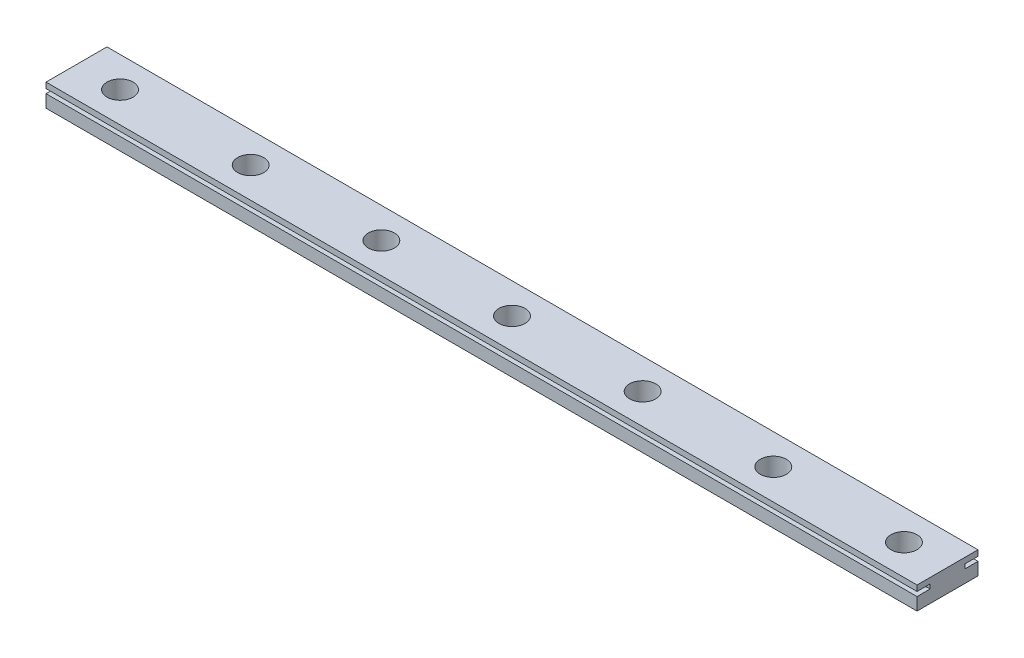
ISO-10303-21;
HEADER;
FILE_DESCRIPTION(('STEP AP214'),'2;1');
FILE_NAME('part.step','',(''),(''),'','','');
FILE_SCHEMA(('AUTOMOTIVE_DESIGN { 1 0 10303 214 1 1 1 1 }'));
ENDSEC;
DATA;
#1=APPLICATION_CONTEXT('core data for automotive mechanical design processes');
#2=APPLICATION_PROTOCOL_DEFINITION('international standard','automotive_design',2000,#1);
#3=PRODUCT_CONTEXT('',#1,'mechanical');
#4=PRODUCT('Part','Part','',(#3));
#5=PRODUCT_RELATED_PRODUCT_CATEGORY('part','',(#4));
#6=PRODUCT_DEFINITION_FORMATION('','',#4);
#7=PRODUCT_DEFINITION_CONTEXT('part definition',#1,'design');
#8=PRODUCT_DEFINITION('design','',#6,#7);
#9=PRODUCT_DEFINITION_SHAPE('','',#8);
#10=(LENGTH_UNIT() NAMED_UNIT(*) SI_UNIT(.MILLI.,.METRE.));
#11=(NAMED_UNIT(*) PLANE_ANGLE_UNIT() SI_UNIT($,.RADIAN.));
#12=(NAMED_UNIT(*) SI_UNIT($,.STERADIAN.) SOLID_ANGLE_UNIT());
#13=UNCERTAINTY_MEASURE_WITH_UNIT(LENGTH_MEASURE(1.E-05),#10,'distance_accuracy_value','');
#14=(GEOMETRIC_REPRESENTATION_CONTEXT(3) GLOBAL_UNCERTAINTY_ASSIGNED_CONTEXT((#13)) GLOBAL_UNIT_ASSIGNED_CONTEXT((#10,
#11,#12)) REPRESENTATION_CONTEXT('',''));
#15=CARTESIAN_POINT('',(0.,0.,0.));
#16=DIRECTION('',(0.,0.,1.));
#17=DIRECTION('',(1.,0.,0.));
#18=AXIS2_PLACEMENT_3D('',#15,#16,#17);
#19=CARTESIAN_POINT('',(190.,-25.8,-7.));
#20=DIRECTION('',(0.,1.,0.));
#21=DIRECTION('',(0.,0.,1.));
#22=AXIS2_PLACEMENT_3D('',#19,#20,#21);
#23=CYLINDRICAL_SURFACE('',#22,1.75);
#24=CARTESIAN_POINT('',(190.,0.,-7.));
#25=DIRECTION('',(0.,-1.,0.));
#26=DIRECTION('',(0.,0.,-1.));
#27=AXIS2_PLACEMENT_3D('',#24,#25,#26);
#28=CIRCLE('',#27,1.75);
#29=CARTESIAN_POINT('',(190.,0.,-8.75));
#30=VERTEX_POINT('',#29);
#31=EDGE_CURVE('E226',#30,#30,#28,.T.);
#32=ORIENTED_EDGE('',*,*,#31,.T.);
#33=EDGE_LOOP('',(#32));
#34=FACE_BOUND('',#33,.T.);
#35=CARTESIAN_POINT('',(190.,0.7,-7.));
#36=DIRECTION('',(0.,1.,0.));
#37=DIRECTION('',(0.,0.,1.));
#38=AXIS2_PLACEMENT_3D('',#35,#36,#37);
#39=CIRCLE('',#38,1.75);
#40=CARTESIAN_POINT('',(190.,0.7,-5.25));
#41=VERTEX_POINT('',#40);
#42=EDGE_CURVE('E658',#41,#41,#39,.T.);
#43=ORIENTED_EDGE('',*,*,#42,.T.);
#44=EDGE_LOOP('',(#43));
#45=FACE_BOUND('',#44,.T.);
#46=ADVANCED_FACE('F78',(#34,#45),#23,.F.);
#47=CARTESIAN_POINT('',(160.,-25.8,-7.));
#48=DIRECTION('',(0.,1.,0.));
#49=DIRECTION('',(0.,0.,1.));
#50=AXIS2_PLACEMENT_3D('',#47,#48,#49);
#51=CYLINDRICAL_SURFACE('',#50,1.75);
#52=CARTESIAN_POINT('',(160.,0.,-7.));
#53=DIRECTION('',(0.,-1.,0.));
#54=DIRECTION('',(0.,0.,-1.));
#55=AXIS2_PLACEMENT_3D('',#52,#53,#54);
#56=CIRCLE('',#55,1.75);
#57=CARTESIAN_POINT('',(160.,0.,-8.75));
#58=VERTEX_POINT('',#57);
#59=EDGE_CURVE('E229',#58,#58,#56,.T.);
#60=ORIENTED_EDGE('',*,*,#59,.T.);
#61=EDGE_LOOP('',(#60));
#62=FACE_BOUND('',#61,.T.);
#63=CARTESIAN_POINT('',(160.,0.7,-7.));
#64=DIRECTION('',(0.,1.,0.));
#65=DIRECTION('',(0.,0.,1.));
#66=AXIS2_PLACEMENT_3D('',#63,#64,#65);
#67=CIRCLE('',#66,1.75);
#68=CARTESIAN_POINT('',(160.,0.7,-5.25));
#69=VERTEX_POINT('',#68);
#70=EDGE_CURVE('E662',#69,#69,#67,.T.);
#71=ORIENTED_EDGE('',*,*,#70,.T.);
#72=EDGE_LOOP('',(#71));
#73=FACE_BOUND('',#72,.T.);
#74=ADVANCED_FACE('F319',(#62,#73),#51,.F.);
#75=CARTESIAN_POINT('',(130.,-25.8,-7.));
#76=DIRECTION('',(0.,1.,0.));
#77=DIRECTION('',(0.,0.,1.));
#78=AXIS2_PLACEMENT_3D('',#75,#76,#77);
#79=CYLINDRICAL_SURFACE('',#78,1.75);
#80=CARTESIAN_POINT('',(130.,0.,-7.));
#81=DIRECTION('',(0.,-1.,0.));
#82=DIRECTION('',(0.,0.,-1.));
#83=AXIS2_PLACEMENT_3D('',#80,#81,#82);
#84=CIRCLE('',#83,1.75);
#85=CARTESIAN_POINT('',(130.,0.,-8.75));
#86=VERTEX_POINT('',#85);
#87=EDGE_CURVE('E233',#86,#86,#84,.T.);
#88=ORIENTED_EDGE('',*,*,#87,.T.);
#89=EDGE_LOOP('',(#88));
#90=FACE_BOUND('',#89,.T.);
#91=CARTESIAN_POINT('',(130.,0.7,-7.));
#92=DIRECTION('',(0.,1.,0.));
#93=DIRECTION('',(0.,0.,1.));
#94=AXIS2_PLACEMENT_3D('',#91,#92,#93);
#95=CIRCLE('',#94,1.75);
#96=CARTESIAN_POINT('',(130.,0.7,-5.25));
#97=VERTEX_POINT('',#96);
#98=EDGE_CURVE('E673',#97,#97,#95,.T.);
#99=ORIENTED_EDGE('',*,*,#98,.T.);
#100=EDGE_LOOP('',(#99));
#101=FACE_BOUND('',#100,.T.);
#102=ADVANCED_FACE('F325',(#90,#101),#79,.F.);
#103=CARTESIAN_POINT('',(100.,-25.8,-7.));
#104=DIRECTION('',(0.,1.,0.));
#105=DIRECTION('',(0.,0.,1.));
#106=AXIS2_PLACEMENT_3D('',#103,#104,#105);
#107=CYLINDRICAL_SURFACE('',#106,1.75);
#108=CARTESIAN_POINT('',(100.,0.,-7.));
#109=DIRECTION('',(0.,-1.,0.));
#110=DIRECTION('',(0.,0.,-1.));
#111=AXIS2_PLACEMENT_3D('',#108,#109,#110);
#112=CIRCLE('',#111,1.75);
#113=CARTESIAN_POINT('',(100.,0.,-8.75));
#114=VERTEX_POINT('',#113);
#115=EDGE_CURVE('E236',#114,#114,#112,.T.);
#116=ORIENTED_EDGE('',*,*,#115,.T.);
#117=EDGE_LOOP('',(#116));
#118=FACE_BOUND('',#117,.T.);
#119=CARTESIAN_POINT('',(100.,0.7,-7.));
#120=DIRECTION('',(0.,1.,0.));
#121=DIRECTION('',(0.,0.,1.));
#122=AXIS2_PLACEMENT_3D('',#119,#120,#121);
#123=CIRCLE('',#122,1.75);
#124=CARTESIAN_POINT('',(100.,0.7,-5.25));
#125=VERTEX_POINT('',#124);
#126=EDGE_CURVE('E681',#125,#125,#123,.T.);
#127=ORIENTED_EDGE('',*,*,#126,.T.);
#128=EDGE_LOOP('',(#127));
#129=FACE_BOUND('',#128,.T.);
#130=ADVANCED_FACE('F492',(#118,#129),#107,.F.);
#131=CARTESIAN_POINT('',(70.,-25.8,-7.));
#132=DIRECTION('',(0.,1.,0.));
#133=DIRECTION('',(0.,0.,1.));
#134=AXIS2_PLACEMENT_3D('',#131,#132,#133);
#135=CYLINDRICAL_SURFACE('',#134,1.75);
#136=CARTESIAN_POINT('',(70.,0.,-7.));
#137=DIRECTION('',(0.,-1.,0.));
#138=DIRECTION('',(0.,0.,-1.));
#139=AXIS2_PLACEMENT_3D('',#136,#137,#138);
#140=CIRCLE('',#139,1.75);
#141=CARTESIAN_POINT('',(70.,0.,-8.75));
#142=VERTEX_POINT('',#141);
#143=EDGE_CURVE('E238',#142,#142,#140,.T.);
#144=ORIENTED_EDGE('',*,*,#143,.T.);
#145=EDGE_LOOP('',(#144));
#146=FACE_BOUND('',#145,.T.);
#147=CARTESIAN_POINT('',(70.,0.7,-7.));
#148=DIRECTION('',(0.,1.,0.));
#149=DIRECTION('',(0.,0.,1.));
#150=AXIS2_PLACEMENT_3D('',#147,#148,#149);
#151=CIRCLE('',#150,1.75);
#152=CARTESIAN_POINT('',(70.,0.7,-5.25));
#153=VERTEX_POINT('',#152);
#154=EDGE_CURVE('E690',#153,#153,#151,.T.);
#155=ORIENTED_EDGE('',*,*,#154,.T.);
#156=EDGE_LOOP('',(#155));
#157=FACE_BOUND('',#156,.T.);
#158=ADVANCED_FACE('F501',(#146,#157),#135,.F.);
#159=CARTESIAN_POINT('',(40.,-25.8,-7.));
#160=DIRECTION('',(0.,1.,0.));
#161=DIRECTION('',(0.,0.,1.));
#162=AXIS2_PLACEMENT_3D('',#159,#160,#161);
#163=CYLINDRICAL_SURFACE('',#162,1.75);
#164=CARTESIAN_POINT('',(40.,0.,-7.));
#165=DIRECTION('',(0.,-1.,0.));
#166=DIRECTION('',(0.,0.,-1.));
#167=AXIS2_PLACEMENT_3D('',#164,#165,#166);
#168=CIRCLE('',#167,1.75);
#169=CARTESIAN_POINT('',(40.,0.,-8.75));
#170=VERTEX_POINT('',#169);
#171=EDGE_CURVE('E82',#170,#170,#168,.T.);
#172=ORIENTED_EDGE('',*,*,#171,.T.);
#173=EDGE_LOOP('',(#172));
#174=FACE_BOUND('',#173,.T.);
#175=CARTESIAN_POINT('',(40.,0.7,-7.));
#176=DIRECTION('',(0.,1.,0.));
#177=DIRECTION('',(0.,0.,1.));
#178=AXIS2_PLACEMENT_3D('',#175,#176,#177);
#179=CIRCLE('',#178,1.75);
#180=CARTESIAN_POINT('',(40.,0.7,-5.25));
#181=VERTEX_POINT('',#180);
#182=EDGE_CURVE('E699',#181,#181,#179,.T.);
#183=ORIENTED_EDGE('',*,*,#182,.T.);
#184=EDGE_LOOP('',(#183));
#185=FACE_BOUND('',#184,.T.);
#186=ADVANCED_FACE('F343',(#174,#185),#163,.F.);
#187=CARTESIAN_POINT('',(10.,-25.8,-7.));
#188=DIRECTION('',(0.,1.,0.));
#189=DIRECTION('',(0.,0.,1.));
#190=AXIS2_PLACEMENT_3D('',#187,#188,#189);
#191=CYLINDRICAL_SURFACE('',#190,1.75);
#192=CARTESIAN_POINT('',(10.,0.,-7.));
#193=DIRECTION('',(0.,-1.,0.));
#194=DIRECTION('',(0.,0.,-1.));
#195=AXIS2_PLACEMENT_3D('',#192,#193,#194);
#196=CIRCLE('',#195,1.75);
#197=CARTESIAN_POINT('',(10.,0.,-8.75));
#198=VERTEX_POINT('',#197);
#199=EDGE_CURVE('E221',#198,#198,#196,.T.);
#200=ORIENTED_EDGE('',*,*,#199,.T.);
#201=EDGE_LOOP('',(#200));
#202=FACE_BOUND('',#201,.T.);
#203=CARTESIAN_POINT('',(10.,0.7,-7.));
#204=DIRECTION('',(0.,1.,0.));
#205=DIRECTION('',(0.,0.,1.));
#206=AXIS2_PLACEMENT_3D('',#203,#204,#205);
#207=CIRCLE('',#206,1.75);
#208=CARTESIAN_POINT('',(10.,0.7,-5.25));
#209=VERTEX_POINT('',#208);
#210=EDGE_CURVE('E243',#209,#209,#207,.T.);
#211=ORIENTED_EDGE('',*,*,#210,.T.);
#212=EDGE_LOOP('',(#211));
#213=FACE_BOUND('',#212,.T.);
#214=ADVANCED_FACE('F316',(#202,#213),#191,.F.);
#215=CARTESIAN_POINT('',(0.,5.2,0.));
#216=DIRECTION('',(0.,0.,-1.));
#217=DIRECTION('',(-1.,0.,0.));
#218=AXIS2_PLACEMENT_3D('',#215,#216,#217);
#219=PLANE('',#218);
#220=DIRECTION('',(0.,-1.,0.));
#221=VECTOR('',#220,1.);
#222=CARTESIAN_POINT('',(0.,5.2,0.));
#223=LINE('',#222,#221);
#224=CARTESIAN_POINT('',(0.,5.2,0.));
#225=VERTEX_POINT('',#224);
#226=CARTESIAN_POINT('',(0.,3.9,0.));
#227=VERTEX_POINT('',#226);
#228=EDGE_CURVE('E177',#225,#227,#223,.T.);
#229=ORIENTED_EDGE('',*,*,#228,.T.);
#230=DIRECTION('',(-1.,0.,0.));
#231=VECTOR('',#230,1.);
#232=CARTESIAN_POINT('',(210.,3.9,0.));
#233=LINE('',#232,#231);
#234=CARTESIAN_POINT('',(200.,3.9,0.));
#235=VERTEX_POINT('',#234);
#236=EDGE_CURVE('E275',#235,#227,#233,.T.);
#237=ORIENTED_EDGE('',*,*,#236,.F.);
#238=DIRECTION('',(0.,-1.,0.));
#239=VECTOR('',#238,1.);
#240=CARTESIAN_POINT('',(200.,5.2,0.));
#241=LINE('',#240,#239);
#242=CARTESIAN_POINT('',(200.,5.2,0.));
#243=VERTEX_POINT('',#242);
#244=EDGE_CURVE('E206',#243,#235,#241,.T.);
#245=ORIENTED_EDGE('',*,*,#244,.F.);
#246=DIRECTION('',(1.,0.,0.));
#247=VECTOR('',#246,1.);
#248=CARTESIAN_POINT('',(0.,5.2,0.));
#249=LINE('',#248,#247);
#250=EDGE_CURVE('E287',#225,#243,#249,.T.);
#251=ORIENTED_EDGE('',*,*,#250,.F.);
#252=EDGE_LOOP('',(#229,#237,#245,#251));
#253=FACE_BOUND('',#252,.T.);
#254=ADVANCED_FACE('F308',(#253),#219,.F.);
#255=CARTESIAN_POINT('',(0.,5.2,-14.));
#256=DIRECTION('',(0.,0.,1.));
#257=DIRECTION('',(1.,0.,0.));
#258=AXIS2_PLACEMENT_3D('',#255,#256,#257);
#259=PLANE('',#258);
#260=DIRECTION('',(0.,-1.,0.));
#261=VECTOR('',#260,1.);
#262=CARTESIAN_POINT('',(200.,5.2,-14.));
#263=LINE('',#262,#261);
#264=CARTESIAN_POINT('',(200.,5.2,-14.));
#265=VERTEX_POINT('',#264);
#266=CARTESIAN_POINT('',(200.,3.9,-14.));
#267=VERTEX_POINT('',#266);
#268=EDGE_CURVE('E202',#265,#267,#263,.T.);
#269=ORIENTED_EDGE('',*,*,#268,.T.);
#270=DIRECTION('',(-1.,0.,0.));
#271=VECTOR('',#270,1.);
#272=CARTESIAN_POINT('',(0.,3.9,-14.));
#273=LINE('',#272,#271);
#274=CARTESIAN_POINT('',(0.,3.9,-14.));
#275=VERTEX_POINT('',#274);
#276=EDGE_CURVE('E176',#267,#275,#273,.T.);
#277=ORIENTED_EDGE('',*,*,#276,.T.);
#278=DIRECTION('',(0.,-1.,0.));
#279=VECTOR('',#278,1.);
#280=CARTESIAN_POINT('',(0.,5.2,-14.));
#281=LINE('',#280,#279);
#282=CARTESIAN_POINT('',(0.,5.2,-14.));
#283=VERTEX_POINT('',#282);
#284=EDGE_CURVE('E193',#283,#275,#281,.T.);
#285=ORIENTED_EDGE('',*,*,#284,.F.);
#286=DIRECTION('',(-1.,0.,0.));
#287=VECTOR('',#286,1.);
#288=CARTESIAN_POINT('',(0.,5.2,-14.));
#289=LINE('',#288,#287);
#290=EDGE_CURVE('E194',#265,#283,#289,.T.);
#291=ORIENTED_EDGE('',*,*,#290,.F.);
#292=EDGE_LOOP('',(#269,#277,#285,#291));
#293=FACE_BOUND('',#292,.T.);
#294=ADVANCED_FACE('F314',(#293),#259,.F.);
#295=CARTESIAN_POINT('',(0.,5.2,0.));
#296=DIRECTION('',(1.,0.,0.));
#297=DIRECTION('',(0.,0.,-1.));
#298=AXIS2_PLACEMENT_3D('',#295,#296,#297);
#299=PLANE('',#298);
#300=ORIENTED_EDGE('',*,*,#284,.T.);
#301=DIRECTION('',(0.,0.,-1.));
#302=VECTOR('',#301,1.);
#303=CARTESIAN_POINT('',(0.,3.9,-11.));
#304=LINE('',#303,#302);
#305=CARTESIAN_POINT('',(0.,3.9,-11.));
#306=VERTEX_POINT('',#305);
#307=EDGE_CURVE('E260',#306,#275,#304,.T.);
#308=ORIENTED_EDGE('',*,*,#307,.F.);
#309=DIRECTION('',(0.,1.,0.));
#310=VECTOR('',#309,1.);
#311=CARTESIAN_POINT('',(0.,2.9,-11.));
#312=LINE('',#311,#310);
#313=CARTESIAN_POINT('',(0.,2.9,-11.));
#314=VERTEX_POINT('',#313);
#315=EDGE_CURVE('E186',#314,#306,#312,.T.);
#316=ORIENTED_EDGE('',*,*,#315,.F.);
#317=DIRECTION('',(0.,0.,1.));
#318=VECTOR('',#317,1.);
#319=CARTESIAN_POINT('',(0.,2.9,-14.));
#320=LINE('',#319,#318);
#321=CARTESIAN_POINT('',(0.,2.9,-14.));
#322=VERTEX_POINT('',#321);
#323=EDGE_CURVE('E171',#322,#314,#320,.T.);
#324=ORIENTED_EDGE('',*,*,#323,.F.);
#325=CARTESIAN_POINT('',(0.,0.,-14.));
#326=VERTEX_POINT('',#325);
#327=EDGE_CURVE('E182',#322,#326,#281,.T.);
#328=ORIENTED_EDGE('',*,*,#327,.T.);
#329=DIRECTION('',(0.,0.,1.));
#330=VECTOR('',#329,1.);
#331=CARTESIAN_POINT('',(0.,0.,0.));
#332=LINE('',#331,#330);
#333=CARTESIAN_POINT('',(0.,0.,0.));
#334=VERTEX_POINT('',#333);
#335=EDGE_CURVE('E283',#326,#334,#332,.T.);
#336=ORIENTED_EDGE('',*,*,#335,.T.);
#337=CARTESIAN_POINT('',(0.,2.9,0.));
#338=VERTEX_POINT('',#337);
#339=EDGE_CURVE('E209',#338,#334,#223,.T.);
#340=ORIENTED_EDGE('',*,*,#339,.F.);
#341=DIRECTION('',(0.,0.,1.));
#342=VECTOR('',#341,1.);
#343=CARTESIAN_POINT('',(0.,2.9,0.));
#344=LINE('',#343,#342);
#345=CARTESIAN_POINT('',(0.,2.9,-3.));
#346=VERTEX_POINT('',#345);
#347=EDGE_CURVE('E268',#346,#338,#344,.T.);
#348=ORIENTED_EDGE('',*,*,#347,.F.);
#349=DIRECTION('',(0.,-1.,0.));
#350=VECTOR('',#349,1.);
#351=CARTESIAN_POINT('',(0.,2.9,-3.));
#352=LINE('',#351,#350);
#353=CARTESIAN_POINT('',(0.,3.9,-3.));
#354=VERTEX_POINT('',#353);
#355=EDGE_CURVE('E224',#354,#346,#352,.T.);
#356=ORIENTED_EDGE('',*,*,#355,.F.);
#357=DIRECTION('',(0.,0.,-1.));
#358=VECTOR('',#357,1.);
#359=CARTESIAN_POINT('',(0.,3.9,-3.));
#360=LINE('',#359,#358);
#361=EDGE_CURVE('E270',#227,#354,#360,.T.);
#362=ORIENTED_EDGE('',*,*,#361,.F.);
#363=ORIENTED_EDGE('',*,*,#228,.F.);
#364=DIRECTION('',(0.,0.,1.));
#365=VECTOR('',#364,1.);
#366=CARTESIAN_POINT('',(0.,5.2,0.));
#367=LINE('',#366,#365);
#368=EDGE_CURVE('E284',#283,#225,#367,.T.);
#369=ORIENTED_EDGE('',*,*,#368,.F.);
#370=EDGE_LOOP('',(#300,#308,#316,#324,#328,#336,#340,#348,#356,#362,#363,#369));
#371=FACE_BOUND('',#370,.T.);
#372=ADVANCED_FACE('F80',(#371),#299,.F.);
#373=CARTESIAN_POINT('',(200.,2.9,0.));
#374=VERTEX_POINT('',#373);
#375=CARTESIAN_POINT('',(200.,0.,0.));
#376=VERTEX_POINT('',#375);
#377=EDGE_CURVE('E205',#374,#376,#241,.T.);
#378=ORIENTED_EDGE('',*,*,#377,.F.);
#379=DIRECTION('',(-1.,0.,0.));
#380=VECTOR('',#379,1.);
#381=CARTESIAN_POINT('',(210.,2.9,0.));
#382=LINE('',#381,#380);
#383=EDGE_CURVE('E95',#374,#338,#382,.T.);
#384=ORIENTED_EDGE('',*,*,#383,.T.);
#385=ORIENTED_EDGE('',*,*,#339,.T.);
#386=DIRECTION('',(1.,0.,0.));
#387=VECTOR('',#386,1.);
#388=CARTESIAN_POINT('',(0.,0.,0.));
#389=LINE('',#388,#387);
#390=EDGE_CURVE('E291',#334,#376,#389,.T.);
#391=ORIENTED_EDGE('',*,*,#390,.T.);
#392=EDGE_LOOP('',(#378,#384,#385,#391));
#393=FACE_BOUND('',#392,.T.);
#394=ADVANCED_FACE('F306',(#393),#219,.F.);
#395=CARTESIAN_POINT('',(200.,5.2,0.));
#396=DIRECTION('',(-1.,0.,0.));
#397=DIRECTION('',(0.,0.,1.));
#398=AXIS2_PLACEMENT_3D('',#395,#396,#397);
#399=PLANE('',#398);
#400=DIRECTION('',(0.,1.,0.));
#401=VECTOR('',#400,1.);
#402=CARTESIAN_POINT('',(200.,5.2,-11.));
#403=LINE('',#402,#401);
#404=CARTESIAN_POINT('',(200.,2.9,-11.));
#405=VERTEX_POINT('',#404);
#406=CARTESIAN_POINT('',(200.,3.9,-11.));
#407=VERTEX_POINT('',#406);
#408=EDGE_CURVE('E12',#405,#407,#403,.T.);
#409=ORIENTED_EDGE('',*,*,#408,.T.);
#410=DIRECTION('',(0.,0.,-1.));
#411=VECTOR('',#410,1.);
#412=CARTESIAN_POINT('',(200.,3.9,0.));
#413=LINE('',#412,#411);
#414=EDGE_CURVE('E280',#407,#267,#413,.T.);
#415=ORIENTED_EDGE('',*,*,#414,.T.);
#416=ORIENTED_EDGE('',*,*,#268,.F.);
#417=DIRECTION('',(0.,0.,-1.));
#418=VECTOR('',#417,1.);
#419=CARTESIAN_POINT('',(200.,5.2,0.));
#420=LINE('',#419,#418);
#421=EDGE_CURVE('E197',#243,#265,#420,.T.);
#422=ORIENTED_EDGE('',*,*,#421,.F.);
#423=ORIENTED_EDGE('',*,*,#244,.T.);
#424=DIRECTION('',(0.,0.,-1.));
#425=VECTOR('',#424,1.);
#426=CARTESIAN_POINT('',(200.,3.9,0.));
#427=LINE('',#426,#425);
#428=CARTESIAN_POINT('',(200.,3.9,-3.));
#429=VERTEX_POINT('',#428);
#430=EDGE_CURVE('E87',#235,#429,#427,.T.);
#431=ORIENTED_EDGE('',*,*,#430,.T.);
#432=DIRECTION('',(0.,-1.,0.));
#433=VECTOR('',#432,1.);
#434=CARTESIAN_POINT('',(200.,5.2,-3.));
#435=LINE('',#434,#433);
#436=CARTESIAN_POINT('',(200.,2.9,-3.));
#437=VERTEX_POINT('',#436);
#438=EDGE_CURVE('E216',#429,#437,#435,.T.);
#439=ORIENTED_EDGE('',*,*,#438,.T.);
#440=DIRECTION('',(0.,0.,1.));
#441=VECTOR('',#440,1.);
#442=CARTESIAN_POINT('',(200.,2.9,0.));
#443=LINE('',#442,#441);
#444=EDGE_CURVE('E214',#437,#374,#443,.T.);
#445=ORIENTED_EDGE('',*,*,#444,.T.);
#446=ORIENTED_EDGE('',*,*,#377,.T.);
#447=DIRECTION('',(0.,0.,-1.));
#448=VECTOR('',#447,1.);
#449=CARTESIAN_POINT('',(200.,0.,0.));
#450=LINE('',#449,#448);
#451=CARTESIAN_POINT('',(200.,0.,-14.));
#452=VERTEX_POINT('',#451);
#453=EDGE_CURVE('E293',#376,#452,#450,.T.);
#454=ORIENTED_EDGE('',*,*,#453,.T.);
#455=CARTESIAN_POINT('',(200.,2.9,-14.));
#456=VERTEX_POINT('',#455);
#457=EDGE_CURVE('E196',#456,#452,#263,.T.);
#458=ORIENTED_EDGE('',*,*,#457,.F.);
#459=DIRECTION('',(0.,0.,1.));
#460=VECTOR('',#459,1.);
#461=CARTESIAN_POINT('',(200.,2.9,0.));
#462=LINE('',#461,#460);
#463=EDGE_CURVE('E103',#456,#405,#462,.T.);
#464=ORIENTED_EDGE('',*,*,#463,.T.);
#465=EDGE_LOOP('',(#409,#415,#416,#422,#423,#431,#439,#445,#446,#454,#458,#464));
#466=FACE_BOUND('',#465,.T.);
#467=ADVANCED_FACE('F297',(#466),#399,.F.);
#468=ORIENTED_EDGE('',*,*,#327,.F.);
#469=DIRECTION('',(1.,0.,0.));
#470=VECTOR('',#469,1.);
#471=CARTESIAN_POINT('',(0.,2.9,-14.));
#472=LINE('',#471,#470);
#473=EDGE_CURVE('E168',#322,#456,#472,.T.);
#474=ORIENTED_EDGE('',*,*,#473,.T.);
#475=ORIENTED_EDGE('',*,*,#457,.T.);
#476=DIRECTION('',(-1.,0.,0.));
#477=VECTOR('',#476,1.);
#478=CARTESIAN_POINT('',(0.,0.,-14.));
#479=LINE('',#478,#477);
#480=EDGE_CURVE('E191',#452,#326,#479,.T.);
#481=ORIENTED_EDGE('',*,*,#480,.T.);
#482=EDGE_LOOP('',(#468,#474,#475,#481));
#483=FACE_BOUND('',#482,.T.);
#484=ADVANCED_FACE('F189',(#483),#259,.F.);
#485=CARTESIAN_POINT('',(0.,5.2,0.));
#486=DIRECTION('',(0.,-1.,0.));
#487=DIRECTION('',(0.,0.,-1.));
#488=AXIS2_PLACEMENT_3D('',#485,#486,#487);
#489=PLANE('',#488);
#490=CARTESIAN_POINT('',(40.,5.2,-7.));
#491=DIRECTION('',(0.,1.,0.));
#492=DIRECTION('',(0.,0.,1.));
#493=AXIS2_PLACEMENT_3D('',#490,#491,#492);
#494=CIRCLE('',#493,3.);
#495=CARTESIAN_POINT('',(40.,5.2,-4.));
#496=VERTEX_POINT('',#495);
#497=EDGE_CURVE('E702',#496,#496,#494,.T.);
#498=ORIENTED_EDGE('',*,*,#497,.F.);
#499=EDGE_LOOP('',(#498));
#500=FACE_BOUND('',#499,.T.);
#501=CARTESIAN_POINT('',(70.,5.2,-7.));
#502=DIRECTION('',(0.,1.,0.));
#503=DIRECTION('',(0.,0.,1.));
#504=AXIS2_PLACEMENT_3D('',#501,#502,#503);
#505=CIRCLE('',#504,3.);
#506=CARTESIAN_POINT('',(70.,5.2,-4.));
#507=VERTEX_POINT('',#506);
#508=EDGE_CURVE('E693',#507,#507,#505,.T.);
#509=ORIENTED_EDGE('',*,*,#508,.F.);
#510=EDGE_LOOP('',(#509));
#511=FACE_BOUND('',#510,.T.);
#512=CARTESIAN_POINT('',(100.,5.2,-7.));
#513=DIRECTION('',(0.,1.,0.));
#514=DIRECTION('',(0.,0.,1.));
#515=AXIS2_PLACEMENT_3D('',#512,#513,#514);
#516=CIRCLE('',#515,3.);
#517=CARTESIAN_POINT('',(100.,5.2,-4.));
#518=VERTEX_POINT('',#517);
#519=EDGE_CURVE('E684',#518,#518,#516,.T.);
#520=ORIENTED_EDGE('',*,*,#519,.F.);
#521=EDGE_LOOP('',(#520));
#522=FACE_BOUND('',#521,.T.);
#523=CARTESIAN_POINT('',(130.,5.2,-7.));
#524=DIRECTION('',(0.,1.,0.));
#525=DIRECTION('',(0.,0.,1.));
#526=AXIS2_PLACEMENT_3D('',#523,#524,#525);
#527=CIRCLE('',#526,3.);
#528=CARTESIAN_POINT('',(130.,5.2,-4.));
#529=VERTEX_POINT('',#528);
#530=EDGE_CURVE('E675',#529,#529,#527,.T.);
#531=ORIENTED_EDGE('',*,*,#530,.F.);
#532=EDGE_LOOP('',(#531));
#533=FACE_BOUND('',#532,.T.);
#534=CARTESIAN_POINT('',(160.,5.2,-7.));
#535=DIRECTION('',(0.,1.,0.));
#536=DIRECTION('',(0.,0.,1.));
#537=AXIS2_PLACEMENT_3D('',#534,#535,#536);
#538=CIRCLE('',#537,3.);
#539=CARTESIAN_POINT('',(160.,5.2,-4.));
#540=VERTEX_POINT('',#539);
#541=EDGE_CURVE('E664',#540,#540,#538,.T.);
#542=ORIENTED_EDGE('',*,*,#541,.F.);
#543=EDGE_LOOP('',(#542));
#544=FACE_BOUND('',#543,.T.);
#545=CARTESIAN_POINT('',(190.,5.2,-7.));
#546=DIRECTION('',(0.,1.,0.));
#547=DIRECTION('',(0.,0.,1.));
#548=AXIS2_PLACEMENT_3D('',#545,#546,#547);
#549=CIRCLE('',#548,3.);
#550=CARTESIAN_POINT('',(190.,5.2,-4.));
#551=VERTEX_POINT('',#550);
#552=EDGE_CURVE('E255',#551,#551,#549,.T.);
#553=ORIENTED_EDGE('',*,*,#552,.F.);
#554=EDGE_LOOP('',(#553));
#555=FACE_BOUND('',#554,.T.);
#556=CARTESIAN_POINT('',(10.,5.2,-7.));
#557=DIRECTION('',(0.,1.,0.));
#558=DIRECTION('',(0.,0.,1.));
#559=AXIS2_PLACEMENT_3D('',#556,#557,#558);
#560=CIRCLE('',#559,3.);
#561=CARTESIAN_POINT('',(10.,5.2,-4.));
#562=VERTEX_POINT('',#561);
#563=EDGE_CURVE('E247',#562,#562,#560,.T.);
#564=ORIENTED_EDGE('',*,*,#563,.F.);
#565=EDGE_LOOP('',(#564));
#566=FACE_BOUND('',#565,.T.);
#567=ORIENTED_EDGE('',*,*,#368,.T.);
#568=ORIENTED_EDGE('',*,*,#250,.T.);
#569=ORIENTED_EDGE('',*,*,#421,.T.);
#570=ORIENTED_EDGE('',*,*,#290,.T.);
#571=EDGE_LOOP('',(#567,#568,#569,#570));
#572=FACE_BOUND('',#571,.T.);
#573=ADVANCED_FACE('F365',(#500,#511,#522,#533,#544,#555,#566,#572),#489,.F.);
#574=CARTESIAN_POINT('',(0.,0.,0.));
#575=DIRECTION('',(0.,-1.,0.));
#576=DIRECTION('',(0.,0.,-1.));
#577=AXIS2_PLACEMENT_3D('',#574,#575,#576);
#578=PLANE('',#577);
#579=ORIENTED_EDGE('',*,*,#171,.F.);
#580=EDGE_LOOP('',(#579));
#581=FACE_BOUND('',#580,.T.);
#582=ORIENTED_EDGE('',*,*,#143,.F.);
#583=EDGE_LOOP('',(#582));
#584=FACE_BOUND('',#583,.T.);
#585=ORIENTED_EDGE('',*,*,#115,.F.);
#586=EDGE_LOOP('',(#585));
#587=FACE_BOUND('',#586,.T.);
#588=ORIENTED_EDGE('',*,*,#87,.F.);
#589=EDGE_LOOP('',(#588));
#590=FACE_BOUND('',#589,.T.);
#591=ORIENTED_EDGE('',*,*,#59,.F.);
#592=EDGE_LOOP('',(#591));
#593=FACE_BOUND('',#592,.T.);
#594=ORIENTED_EDGE('',*,*,#31,.F.);
#595=EDGE_LOOP('',(#594));
#596=FACE_BOUND('',#595,.T.);
#597=ORIENTED_EDGE('',*,*,#199,.F.);
#598=EDGE_LOOP('',(#597));
#599=FACE_BOUND('',#598,.T.);
#600=ORIENTED_EDGE('',*,*,#335,.F.);
#601=ORIENTED_EDGE('',*,*,#480,.F.);
#602=ORIENTED_EDGE('',*,*,#453,.F.);
#603=ORIENTED_EDGE('',*,*,#390,.F.);
#604=EDGE_LOOP('',(#600,#601,#602,#603));
#605=FACE_BOUND('',#604,.T.);
#606=ADVANCED_FACE('F301',(#581,#584,#587,#590,#593,#596,#599,#605),#578,.T.);
#607=CARTESIAN_POINT('',(210.,2.9,-11.));
#608=DIRECTION('',(0.,0.,1.));
#609=DIRECTION('',(1.,0.,0.));
#610=AXIS2_PLACEMENT_3D('',#607,#608,#609);
#611=PLANE('',#610);
#612=DIRECTION('',(-1.,0.,0.));
#613=VECTOR('',#612,1.);
#614=CARTESIAN_POINT('',(210.,2.9,-11.));
#615=LINE('',#614,#613);
#616=EDGE_CURVE('E262',#405,#314,#615,.T.);
#617=ORIENTED_EDGE('',*,*,#616,.T.);
#618=ORIENTED_EDGE('',*,*,#315,.T.);
#619=DIRECTION('',(-1.,0.,0.));
#620=VECTOR('',#619,1.);
#621=CARTESIAN_POINT('',(210.,3.9,-11.));
#622=LINE('',#621,#620);
#623=EDGE_CURVE('E263',#407,#306,#622,.T.);
#624=ORIENTED_EDGE('',*,*,#623,.F.);
#625=ORIENTED_EDGE('',*,*,#408,.F.);
#626=EDGE_LOOP('',(#617,#618,#624,#625));
#627=FACE_BOUND('',#626,.T.);
#628=ADVANCED_FACE('F348',(#627),#611,.F.);
#629=CARTESIAN_POINT('',(210.,3.9,-11.));
#630=DIRECTION('',(0.,1.,0.));
#631=DIRECTION('',(0.,0.,1.));
#632=AXIS2_PLACEMENT_3D('',#629,#630,#631);
#633=PLANE('',#632);
#634=ORIENTED_EDGE('',*,*,#623,.T.);
#635=ORIENTED_EDGE('',*,*,#307,.T.);
#636=ORIENTED_EDGE('',*,*,#276,.F.);
#637=ORIENTED_EDGE('',*,*,#414,.F.);
#638=EDGE_LOOP('',(#634,#635,#636,#637));
#639=FACE_BOUND('',#638,.T.);
#640=ADVANCED_FACE('F345',(#639),#633,.F.);
#641=CARTESIAN_POINT('',(210.,2.9,-14.));
#642=DIRECTION('',(0.,-1.,0.));
#643=DIRECTION('',(0.,0.,-1.));
#644=AXIS2_PLACEMENT_3D('',#641,#642,#643);
#645=PLANE('',#644);
#646=ORIENTED_EDGE('',*,*,#473,.F.);
#647=ORIENTED_EDGE('',*,*,#323,.T.);
#648=ORIENTED_EDGE('',*,*,#616,.F.);
#649=ORIENTED_EDGE('',*,*,#463,.F.);
#650=EDGE_LOOP('',(#646,#647,#648,#649));
#651=FACE_BOUND('',#650,.T.);
#652=ADVANCED_FACE('F170',(#651),#645,.F.);
#653=CARTESIAN_POINT('',(210.,2.9,-3.));
#654=DIRECTION('',(0.,0.,-1.));
#655=DIRECTION('',(-1.,0.,0.));
#656=AXIS2_PLACEMENT_3D('',#653,#654,#655);
#657=PLANE('',#656);
#658=DIRECTION('',(-1.,0.,0.));
#659=VECTOR('',#658,1.);
#660=CARTESIAN_POINT('',(210.,3.9,-3.));
#661=LINE('',#660,#659);
#662=EDGE_CURVE('E187',#429,#354,#661,.T.);
#663=ORIENTED_EDGE('',*,*,#662,.T.);
#664=ORIENTED_EDGE('',*,*,#355,.T.);
#665=DIRECTION('',(-1.,0.,0.));
#666=VECTOR('',#665,1.);
#667=CARTESIAN_POINT('',(210.,2.9,-3.));
#668=LINE('',#667,#666);
#669=EDGE_CURVE('E273',#437,#346,#668,.T.);
#670=ORIENTED_EDGE('',*,*,#669,.F.);
#671=ORIENTED_EDGE('',*,*,#438,.F.);
#672=EDGE_LOOP('',(#663,#664,#670,#671));
#673=FACE_BOUND('',#672,.T.);
#674=ADVANCED_FACE('F355',(#673),#657,.F.);
#675=CARTESIAN_POINT('',(210.,3.9,-3.));
#676=DIRECTION('',(0.,1.,0.));
#677=DIRECTION('',(0.,0.,1.));
#678=AXIS2_PLACEMENT_3D('',#675,#676,#677);
#679=PLANE('',#678);
#680=ORIENTED_EDGE('',*,*,#236,.T.);
#681=ORIENTED_EDGE('',*,*,#361,.T.);
#682=ORIENTED_EDGE('',*,*,#662,.F.);
#683=ORIENTED_EDGE('',*,*,#430,.F.);
#684=EDGE_LOOP('',(#680,#681,#682,#683));
#685=FACE_BOUND('',#684,.T.);
#686=ADVANCED_FACE('F356',(#685),#679,.F.);
#687=CARTESIAN_POINT('',(210.,2.9,0.));
#688=DIRECTION('',(0.,-1.,0.));
#689=DIRECTION('',(0.,0.,-1.));
#690=AXIS2_PLACEMENT_3D('',#687,#688,#689);
#691=PLANE('',#690);
#692=ORIENTED_EDGE('',*,*,#669,.T.);
#693=ORIENTED_EDGE('',*,*,#347,.T.);
#694=ORIENTED_EDGE('',*,*,#383,.F.);
#695=ORIENTED_EDGE('',*,*,#444,.F.);
#696=EDGE_LOOP('',(#692,#693,#694,#695));
#697=FACE_BOUND('',#696,.T.);
#698=ADVANCED_FACE('F339',(#697),#691,.F.);
#699=CARTESIAN_POINT('',(10.,0.7,-7.));
#700=DIRECTION('',(0.,1.,0.));
#701=DIRECTION('',(0.,0.,1.));
#702=AXIS2_PLACEMENT_3D('',#699,#700,#701);
#703=CYLINDRICAL_SURFACE('',#702,3.);
#704=CARTESIAN_POINT('',(10.,0.7,-7.));
#705=DIRECTION('',(0.,1.,0.));
#706=DIRECTION('',(0.,0.,1.));
#707=AXIS2_PLACEMENT_3D('',#704,#705,#706);
#708=CIRCLE('',#707,3.);
#709=CARTESIAN_POINT('',(10.,0.7,-4.));
#710=VERTEX_POINT('',#709);
#711=EDGE_CURVE('E225',#710,#710,#708,.T.);
#712=ORIENTED_EDGE('',*,*,#711,.F.);
#713=EDGE_LOOP('',(#712));
#714=FACE_BOUND('',#713,.T.);
#715=ORIENTED_EDGE('',*,*,#563,.T.);
#716=EDGE_LOOP('',(#715));
#717=FACE_BOUND('',#716,.T.);
#718=ADVANCED_FACE('F335',(#714,#717),#703,.F.);
#719=CARTESIAN_POINT('',(10.,0.7,-7.));
#720=DIRECTION('',(0.,1.,0.));
#721=DIRECTION('',(0.,0.,1.));
#722=AXIS2_PLACEMENT_3D('',#719,#720,#721);
#723=PLANE('',#722);
#724=ORIENTED_EDGE('',*,*,#210,.F.);
#725=EDGE_LOOP('',(#724));
#726=FACE_BOUND('',#725,.T.);
#727=ORIENTED_EDGE('',*,*,#711,.T.);
#728=EDGE_LOOP('',(#727));
#729=FACE_BOUND('',#728,.T.);
#730=ADVANCED_FACE('F331',(#726,#729),#723,.T.);
#731=CARTESIAN_POINT('',(40.,0.7,-7.));
#732=DIRECTION('',(0.,1.,0.));
#733=DIRECTION('',(0.,0.,1.));
#734=AXIS2_PLACEMENT_3D('',#731,#732,#733);
#735=CYLINDRICAL_SURFACE('',#734,3.);
#736=CARTESIAN_POINT('',(40.,0.7,-7.));
#737=DIRECTION('',(0.,1.,0.));
#738=DIRECTION('',(0.,0.,1.));
#739=AXIS2_PLACEMENT_3D('',#736,#737,#738);
#740=CIRCLE('',#739,3.);
#741=CARTESIAN_POINT('',(40.,0.7,-4.));
#742=VERTEX_POINT('',#741);
#743=EDGE_CURVE('E230',#742,#742,#740,.T.);
#744=ORIENTED_EDGE('',*,*,#743,.F.);
#745=EDGE_LOOP('',(#744));
#746=FACE_BOUND('',#745,.T.);
#747=ORIENTED_EDGE('',*,*,#497,.T.);
#748=EDGE_LOOP('',(#747));
#749=FACE_BOUND('',#748,.T.);
#750=ADVANCED_FACE('F334',(#746,#749),#735,.F.);
#751=CARTESIAN_POINT('',(40.,0.7,-7.));
#752=DIRECTION('',(0.,1.,0.));
#753=DIRECTION('',(0.,0.,1.));
#754=AXIS2_PLACEMENT_3D('',#751,#752,#753);
#755=PLANE('',#754);
#756=ORIENTED_EDGE('',*,*,#182,.F.);
#757=EDGE_LOOP('',(#756));
#758=FACE_BOUND('',#757,.T.);
#759=ORIENTED_EDGE('',*,*,#743,.T.);
#760=EDGE_LOOP('',(#759));
#761=FACE_BOUND('',#760,.T.);
#762=ADVANCED_FACE('F533',(#758,#761),#755,.T.);
#763=CARTESIAN_POINT('',(70.,0.7,-7.));
#764=DIRECTION('',(0.,1.,0.));
#765=DIRECTION('',(0.,0.,1.));
#766=AXIS2_PLACEMENT_3D('',#763,#764,#765);
#767=CYLINDRICAL_SURFACE('',#766,3.);
#768=CARTESIAN_POINT('',(70.,0.7,-7.));
#769=DIRECTION('',(0.,1.,0.));
#770=DIRECTION('',(0.,0.,1.));
#771=AXIS2_PLACEMENT_3D('',#768,#769,#770);
#772=CIRCLE('',#771,3.);
#773=CARTESIAN_POINT('',(70.,0.7,-4.));
#774=VERTEX_POINT('',#773);
#775=EDGE_CURVE('E696',#774,#774,#772,.T.);
#776=ORIENTED_EDGE('',*,*,#775,.F.);
#777=EDGE_LOOP('',(#776));
#778=FACE_BOUND('',#777,.T.);
#779=ORIENTED_EDGE('',*,*,#508,.T.);
#780=EDGE_LOOP('',(#779));
#781=FACE_BOUND('',#780,.T.);
#782=ADVANCED_FACE('F544',(#778,#781),#767,.F.);
#783=CARTESIAN_POINT('',(70.,0.7,-7.));
#784=DIRECTION('',(0.,1.,0.));
#785=DIRECTION('',(0.,0.,1.));
#786=AXIS2_PLACEMENT_3D('',#783,#784,#785);
#787=PLANE('',#786);
#788=ORIENTED_EDGE('',*,*,#154,.F.);
#789=EDGE_LOOP('',(#788));
#790=FACE_BOUND('',#789,.T.);
#791=ORIENTED_EDGE('',*,*,#775,.T.);
#792=EDGE_LOOP('',(#791));
#793=FACE_BOUND('',#792,.T.);
#794=ADVANCED_FACE('F554',(#790,#793),#787,.T.);
#795=CARTESIAN_POINT('',(100.,0.7,-7.));
#796=DIRECTION('',(0.,1.,0.));
#797=DIRECTION('',(0.,0.,1.));
#798=AXIS2_PLACEMENT_3D('',#795,#796,#797);
#799=CYLINDRICAL_SURFACE('',#798,3.);
#800=CARTESIAN_POINT('',(100.,0.7,-7.));
#801=DIRECTION('',(0.,1.,0.));
#802=DIRECTION('',(0.,0.,1.));
#803=AXIS2_PLACEMENT_3D('',#800,#801,#802);
#804=CIRCLE('',#803,3.);
#805=CARTESIAN_POINT('',(100.,0.7,-4.));
#806=VERTEX_POINT('',#805);
#807=EDGE_CURVE('E687',#806,#806,#804,.T.);
#808=ORIENTED_EDGE('',*,*,#807,.F.);
#809=EDGE_LOOP('',(#808));
#810=FACE_BOUND('',#809,.T.);
#811=ORIENTED_EDGE('',*,*,#519,.T.);
#812=EDGE_LOOP('',(#811));
#813=FACE_BOUND('',#812,.T.);
#814=ADVANCED_FACE('F565',(#810,#813),#799,.F.);
#815=CARTESIAN_POINT('',(100.,0.7,-7.));
#816=DIRECTION('',(0.,1.,0.));
#817=DIRECTION('',(0.,0.,1.));
#818=AXIS2_PLACEMENT_3D('',#815,#816,#817);
#819=PLANE('',#818);
#820=ORIENTED_EDGE('',*,*,#126,.F.);
#821=EDGE_LOOP('',(#820));
#822=FACE_BOUND('',#821,.T.);
#823=ORIENTED_EDGE('',*,*,#807,.T.);
#824=EDGE_LOOP('',(#823));
#825=FACE_BOUND('',#824,.T.);
#826=ADVANCED_FACE('F575',(#822,#825),#819,.T.);
#827=CARTESIAN_POINT('',(130.,0.7,-7.));
#828=DIRECTION('',(0.,1.,0.));
#829=DIRECTION('',(0.,0.,1.));
#830=AXIS2_PLACEMENT_3D('',#827,#828,#829);
#831=CYLINDRICAL_SURFACE('',#830,3.);
#832=CARTESIAN_POINT('',(130.,0.7,-7.));
#833=DIRECTION('',(0.,1.,0.));
#834=DIRECTION('',(0.,0.,1.));
#835=AXIS2_PLACEMENT_3D('',#832,#833,#834);
#836=CIRCLE('',#835,3.);
#837=CARTESIAN_POINT('',(130.,0.7,-4.));
#838=VERTEX_POINT('',#837);
#839=EDGE_CURVE('E678',#838,#838,#836,.T.);
#840=ORIENTED_EDGE('',*,*,#839,.F.);
#841=EDGE_LOOP('',(#840));
#842=FACE_BOUND('',#841,.T.);
#843=ORIENTED_EDGE('',*,*,#530,.T.);
#844=EDGE_LOOP('',(#843));
#845=FACE_BOUND('',#844,.T.);
#846=ADVANCED_FACE('F586',(#842,#845),#831,.F.);
#847=CARTESIAN_POINT('',(130.,0.7,-7.));
#848=DIRECTION('',(0.,1.,0.));
#849=DIRECTION('',(0.,0.,1.));
#850=AXIS2_PLACEMENT_3D('',#847,#848,#849);
#851=PLANE('',#850);
#852=ORIENTED_EDGE('',*,*,#98,.F.);
#853=EDGE_LOOP('',(#852));
#854=FACE_BOUND('',#853,.T.);
#855=ORIENTED_EDGE('',*,*,#839,.T.);
#856=EDGE_LOOP('',(#855));
#857=FACE_BOUND('',#856,.T.);
#858=ADVANCED_FACE('F596',(#854,#857),#851,.T.);
#859=CARTESIAN_POINT('',(160.,0.7,-7.));
#860=DIRECTION('',(0.,1.,0.));
#861=DIRECTION('',(0.,0.,1.));
#862=AXIS2_PLACEMENT_3D('',#859,#860,#861);
#863=CYLINDRICAL_SURFACE('',#862,3.);
#864=CARTESIAN_POINT('',(160.,0.7,-7.));
#865=DIRECTION('',(0.,1.,0.));
#866=DIRECTION('',(0.,0.,1.));
#867=AXIS2_PLACEMENT_3D('',#864,#865,#866);
#868=CIRCLE('',#867,3.);
#869=CARTESIAN_POINT('',(160.,0.7,-4.));
#870=VERTEX_POINT('',#869);
#871=EDGE_CURVE('E671',#870,#870,#868,.T.);
#872=ORIENTED_EDGE('',*,*,#871,.F.);
#873=EDGE_LOOP('',(#872));
#874=FACE_BOUND('',#873,.T.);
#875=ORIENTED_EDGE('',*,*,#541,.T.);
#876=EDGE_LOOP('',(#875));
#877=FACE_BOUND('',#876,.T.);
#878=ADVANCED_FACE('F607',(#874,#877),#863,.F.);
#879=CARTESIAN_POINT('',(160.,0.7,-7.));
#880=DIRECTION('',(0.,1.,0.));
#881=DIRECTION('',(0.,0.,1.));
#882=AXIS2_PLACEMENT_3D('',#879,#880,#881);
#883=PLANE('',#882);
#884=ORIENTED_EDGE('',*,*,#70,.F.);
#885=EDGE_LOOP('',(#884));
#886=FACE_BOUND('',#885,.T.);
#887=ORIENTED_EDGE('',*,*,#871,.T.);
#888=EDGE_LOOP('',(#887));
#889=FACE_BOUND('',#888,.T.);
#890=ADVANCED_FACE('F617',(#886,#889),#883,.T.);
#891=CARTESIAN_POINT('',(190.,0.7,-7.));
#892=DIRECTION('',(0.,1.,0.));
#893=DIRECTION('',(0.,0.,1.));
#894=AXIS2_PLACEMENT_3D('',#891,#892,#893);
#895=CYLINDRICAL_SURFACE('',#894,3.);
#896=CARTESIAN_POINT('',(190.,0.7,-7.));
#897=DIRECTION('',(0.,1.,0.));
#898=DIRECTION('',(0.,0.,1.));
#899=AXIS2_PLACEMENT_3D('',#896,#897,#898);
#900=CIRCLE('',#899,3.);
#901=CARTESIAN_POINT('',(190.,0.7,-4.));
#902=VERTEX_POINT('',#901);
#903=EDGE_CURVE('E661',#902,#902,#900,.T.);
#904=ORIENTED_EDGE('',*,*,#903,.F.);
#905=EDGE_LOOP('',(#904));
#906=FACE_BOUND('',#905,.T.);
#907=ORIENTED_EDGE('',*,*,#552,.T.);
#908=EDGE_LOOP('',(#907));
#909=FACE_BOUND('',#908,.T.);
#910=ADVANCED_FACE('F628',(#906,#909),#895,.F.);
#911=CARTESIAN_POINT('',(190.,0.7,-7.));
#912=DIRECTION('',(0.,1.,0.));
#913=DIRECTION('',(0.,0.,1.));
#914=AXIS2_PLACEMENT_3D('',#911,#912,#913);
#915=PLANE('',#914);
#916=ORIENTED_EDGE('',*,*,#42,.F.);
#917=EDGE_LOOP('',(#916));
#918=FACE_BOUND('',#917,.T.);
#919=ORIENTED_EDGE('',*,*,#903,.T.);
#920=EDGE_LOOP('',(#919));
#921=FACE_BOUND('',#920,.T.);
#922=ADVANCED_FACE('F638',(#918,#921),#915,.T.);
#923=CLOSED_SHELL('',(#46,#74,#102,#130,#158,#186,#214,#254,#294,#372,#394,#467,#484,#573,#606,
#628,#640,#652,#674,#686,#698,#718,#730,#750,#762,#782,#794,#814,#826,#846,#858,#878,#890,#910,#922));
#924=MANIFOLD_SOLID_BREP('B2',#923);
#925=ADVANCED_BREP_SHAPE_REPRESENTATION('',(#18,#924),#14);
#926=SHAPE_DEFINITION_REPRESENTATION(#9,#925);
ENDSEC;
END-ISO-10303-21;
